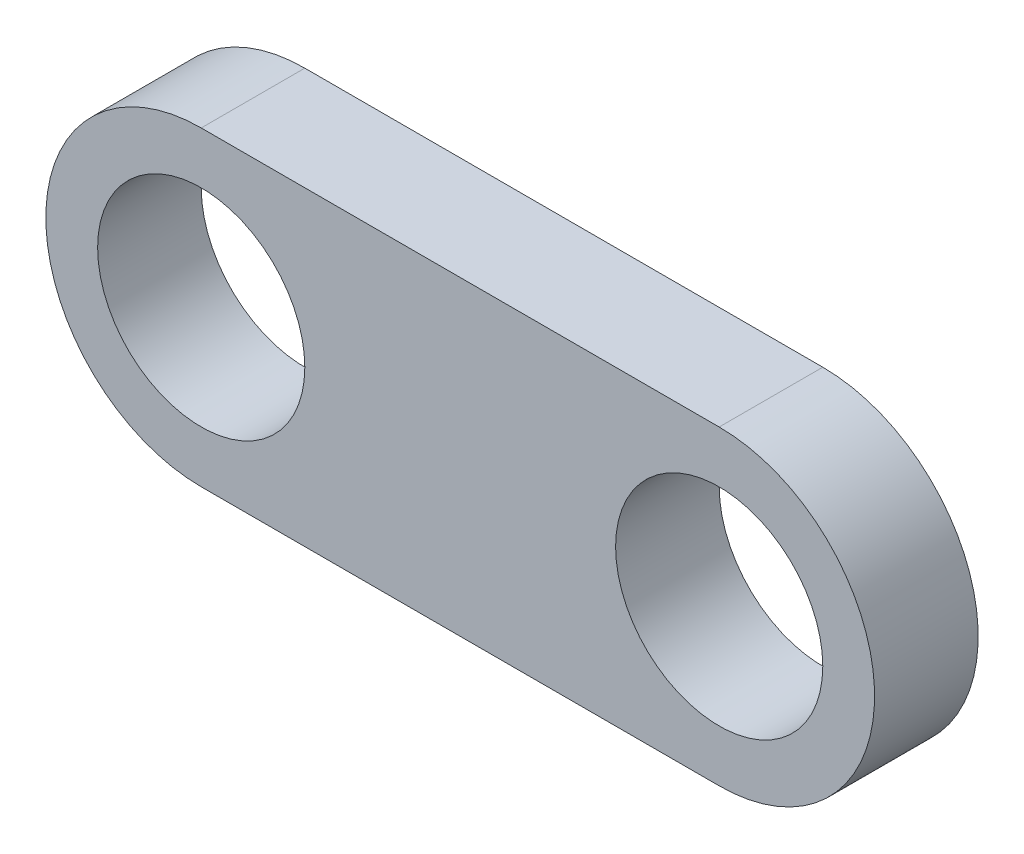
ISO-10303-21;
HEADER;
FILE_DESCRIPTION(('STEP AP214'),'2;1');
FILE_NAME('part.step','',(''),(''),'','','');
FILE_SCHEMA(('AUTOMOTIVE_DESIGN { 1 0 10303 214 1 1 1 1 }'));
ENDSEC;
DATA;
#1=APPLICATION_CONTEXT('core data for automotive mechanical design processes');
#2=APPLICATION_PROTOCOL_DEFINITION('international standard','automotive_design',2000,#1);
#3=PRODUCT_CONTEXT('',#1,'mechanical');
#4=PRODUCT('Part','Part','',(#3));
#5=PRODUCT_RELATED_PRODUCT_CATEGORY('part','',(#4));
#6=PRODUCT_DEFINITION_FORMATION('','',#4);
#7=PRODUCT_DEFINITION_CONTEXT('part definition',#1,'design');
#8=PRODUCT_DEFINITION('design','',#6,#7);
#9=PRODUCT_DEFINITION_SHAPE('','',#8);
#10=(LENGTH_UNIT() NAMED_UNIT(*) SI_UNIT(.MILLI.,.METRE.));
#11=(NAMED_UNIT(*) PLANE_ANGLE_UNIT() SI_UNIT($,.RADIAN.));
#12=(NAMED_UNIT(*) SI_UNIT($,.STERADIAN.) SOLID_ANGLE_UNIT());
#13=UNCERTAINTY_MEASURE_WITH_UNIT(LENGTH_MEASURE(1.E-05),#10,'distance_accuracy_value','');
#14=(GEOMETRIC_REPRESENTATION_CONTEXT(3) GLOBAL_UNCERTAINTY_ASSIGNED_CONTEXT((#13)) GLOBAL_UNIT_ASSIGNED_CONTEXT((#10,
#11,#12)) REPRESENTATION_CONTEXT('',''));
#15=CARTESIAN_POINT('',(0.,0.,0.));
#16=DIRECTION('',(0.,0.,1.));
#17=DIRECTION('',(1.,0.,0.));
#18=AXIS2_PLACEMENT_3D('',#15,#16,#17);
#19=CARTESIAN_POINT('',(0.,0.,5.));
#20=DIRECTION('',(0.,0.,1.));
#21=DIRECTION('',(1.,0.,0.));
#22=AXIS2_PLACEMENT_3D('',#19,#20,#21);
#23=PLANE('',#22);
#24=CARTESIAN_POINT('',(-50.,0.,5.));
#25=DIRECTION('',(0.,0.,1.));
#26=DIRECTION('',(1.,0.,0.));
#27=AXIS2_PLACEMENT_3D('',#24,#25,#26);
#28=CIRCLE('',#27,10.);
#29=CARTESIAN_POINT('',(-40.,0.,5.));
#30=VERTEX_POINT('',#29);
#31=EDGE_CURVE('E100',#30,#30,#28,.T.);
#32=ORIENTED_EDGE('',*,*,#31,.F.);
#33=EDGE_LOOP('',(#32));
#34=FACE_BOUND('',#33,.T.);
#35=CARTESIAN_POINT('',(0.,0.,5.));
#36=DIRECTION('',(0.,0.,1.));
#37=DIRECTION('',(1.,0.,0.));
#38=AXIS2_PLACEMENT_3D('',#35,#36,#37);
#39=CIRCLE('',#38,15.);
#40=CARTESIAN_POINT('',(0.,-15.,5.));
#41=VERTEX_POINT('',#40);
#42=CARTESIAN_POINT('',(0.,15.,5.));
#43=VERTEX_POINT('',#42);
#44=EDGE_CURVE('E85',#41,#43,#39,.T.);
#45=ORIENTED_EDGE('',*,*,#44,.T.);
#46=DIRECTION('',(-1.,0.,0.));
#47=VECTOR('',#46,1.);
#48=CARTESIAN_POINT('',(0.,15.,5.));
#49=LINE('',#48,#47);
#50=CARTESIAN_POINT('',(-50.,15.,5.));
#51=VERTEX_POINT('',#50);
#52=EDGE_CURVE('E80',#43,#51,#49,.T.);
#53=ORIENTED_EDGE('',*,*,#52,.T.);
#54=CARTESIAN_POINT('',(-50.,0.,5.));
#55=DIRECTION('',(0.,0.,1.));
#56=DIRECTION('',(1.,0.,0.));
#57=AXIS2_PLACEMENT_3D('',#54,#55,#56);
#58=CIRCLE('',#57,15.);
#59=CARTESIAN_POINT('',(-50.,-15.,5.));
#60=VERTEX_POINT('',#59);
#61=EDGE_CURVE('E83',#51,#60,#58,.T.);
#62=ORIENTED_EDGE('',*,*,#61,.T.);
#63=DIRECTION('',(1.,0.,0.));
#64=VECTOR('',#63,1.);
#65=CARTESIAN_POINT('',(0.,-15.,5.));
#66=LINE('',#65,#64);
#67=EDGE_CURVE('E50',#60,#41,#66,.T.);
#68=ORIENTED_EDGE('',*,*,#67,.T.);
#69=EDGE_LOOP('',(#45,#53,#62,#68));
#70=FACE_BOUND('',#69,.T.);
#71=CARTESIAN_POINT('',(0.,0.,5.));
#72=DIRECTION('',(0.,0.,1.));
#73=DIRECTION('',(1.,0.,0.));
#74=AXIS2_PLACEMENT_3D('',#71,#72,#73);
#75=CIRCLE('',#74,10.);
#76=CARTESIAN_POINT('',(10.,0.,5.));
#77=VERTEX_POINT('',#76);
#78=EDGE_CURVE('E115',#77,#77,#75,.T.);
#79=ORIENTED_EDGE('',*,*,#78,.F.);
#80=EDGE_LOOP('',(#79));
#81=FACE_BOUND('',#80,.T.);
#82=ADVANCED_FACE('F33',(#34,#70,#81),#23,.T.);
#83=CARTESIAN_POINT('',(0.,0.,-5.));
#84=DIRECTION('',(0.,0.,1.));
#85=DIRECTION('',(1.,0.,0.));
#86=AXIS2_PLACEMENT_3D('',#83,#84,#85);
#87=PLANE('',#86);
#88=CARTESIAN_POINT('',(0.,0.,-5.));
#89=DIRECTION('',(0.,0.,1.));
#90=DIRECTION('',(1.,0.,0.));
#91=AXIS2_PLACEMENT_3D('',#88,#89,#90);
#92=CIRCLE('',#91,15.);
#93=CARTESIAN_POINT('',(0.,-15.,-5.));
#94=VERTEX_POINT('',#93);
#95=CARTESIAN_POINT('',(0.,15.,-5.));
#96=VERTEX_POINT('',#95);
#97=EDGE_CURVE('E97',#94,#96,#92,.T.);
#98=ORIENTED_EDGE('',*,*,#97,.F.);
#99=DIRECTION('',(1.,0.,0.));
#100=VECTOR('',#99,1.);
#101=CARTESIAN_POINT('',(0.,-15.,-5.));
#102=LINE('',#101,#100);
#103=CARTESIAN_POINT('',(-50.,-15.,-5.));
#104=VERTEX_POINT('',#103);
#105=EDGE_CURVE('E73',#104,#94,#102,.T.);
#106=ORIENTED_EDGE('',*,*,#105,.F.);
#107=CARTESIAN_POINT('',(-50.,0.,-5.));
#108=DIRECTION('',(0.,0.,1.));
#109=DIRECTION('',(1.,0.,0.));
#110=AXIS2_PLACEMENT_3D('',#107,#108,#109);
#111=CIRCLE('',#110,15.);
#112=CARTESIAN_POINT('',(-50.,15.,-5.));
#113=VERTEX_POINT('',#112);
#114=EDGE_CURVE('E67',#113,#104,#111,.T.);
#115=ORIENTED_EDGE('',*,*,#114,.F.);
#116=DIRECTION('',(-1.,0.,0.));
#117=VECTOR('',#116,1.);
#118=CARTESIAN_POINT('',(0.,15.,-5.));
#119=LINE('',#118,#117);
#120=EDGE_CURVE('E89',#96,#113,#119,.T.);
#121=ORIENTED_EDGE('',*,*,#120,.F.);
#122=EDGE_LOOP('',(#98,#106,#115,#121));
#123=FACE_BOUND('',#122,.T.);
#124=CARTESIAN_POINT('',(-50.,0.,-5.));
#125=DIRECTION('',(0.,0.,1.));
#126=DIRECTION('',(1.,0.,0.));
#127=AXIS2_PLACEMENT_3D('',#124,#125,#126);
#128=CIRCLE('',#127,10.);
#129=CARTESIAN_POINT('',(-40.,0.,-5.));
#130=VERTEX_POINT('',#129);
#131=EDGE_CURVE('E112',#130,#130,#128,.T.);
#132=ORIENTED_EDGE('',*,*,#131,.T.);
#133=EDGE_LOOP('',(#132));
#134=FACE_BOUND('',#133,.T.);
#135=CARTESIAN_POINT('',(0.,0.,-5.));
#136=DIRECTION('',(0.,0.,1.));
#137=DIRECTION('',(1.,0.,0.));
#138=AXIS2_PLACEMENT_3D('',#135,#136,#137);
#139=CIRCLE('',#138,10.);
#140=CARTESIAN_POINT('',(10.,0.,-5.));
#141=VERTEX_POINT('',#140);
#142=EDGE_CURVE('E118',#141,#141,#139,.T.);
#143=ORIENTED_EDGE('',*,*,#142,.T.);
#144=EDGE_LOOP('',(#143));
#145=FACE_BOUND('',#144,.T.);
#146=ADVANCED_FACE('F108',(#123,#134,#145),#87,.F.);
#147=CARTESIAN_POINT('',(0.,0.,5.));
#148=DIRECTION('',(0.,0.,-1.));
#149=DIRECTION('',(-1.,0.,0.));
#150=AXIS2_PLACEMENT_3D('',#147,#148,#149);
#151=CYLINDRICAL_SURFACE('',#150,15.);
#152=ORIENTED_EDGE('',*,*,#97,.T.);
#153=DIRECTION('',(0.,0.,-1.));
#154=VECTOR('',#153,1.);
#155=CARTESIAN_POINT('',(0.,15.,5.));
#156=LINE('',#155,#154);
#157=EDGE_CURVE('E11',#43,#96,#156,.T.);
#158=ORIENTED_EDGE('',*,*,#157,.F.);
#159=ORIENTED_EDGE('',*,*,#44,.F.);
#160=DIRECTION('',(0.,0.,-1.));
#161=VECTOR('',#160,1.);
#162=CARTESIAN_POINT('',(0.,-15.,5.));
#163=LINE('',#162,#161);
#164=EDGE_CURVE('E93',#41,#94,#163,.T.);
#165=ORIENTED_EDGE('',*,*,#164,.T.);
#166=EDGE_LOOP('',(#152,#158,#159,#165));
#167=FACE_BOUND('',#166,.T.);
#168=ADVANCED_FACE('F35',(#167),#151,.T.);
#169=CARTESIAN_POINT('',(0.,15.,5.));
#170=DIRECTION('',(0.,-1.,0.));
#171=DIRECTION('',(1.,0.,0.));
#172=AXIS2_PLACEMENT_3D('',#169,#170,#171);
#173=PLANE('',#172);
#174=ORIENTED_EDGE('',*,*,#120,.T.);
#175=DIRECTION('',(0.,0.,-1.));
#176=VECTOR('',#175,1.);
#177=CARTESIAN_POINT('',(-50.,15.,5.));
#178=LINE('',#177,#176);
#179=EDGE_CURVE('E42',#51,#113,#178,.T.);
#180=ORIENTED_EDGE('',*,*,#179,.F.);
#181=ORIENTED_EDGE('',*,*,#52,.F.);
#182=ORIENTED_EDGE('',*,*,#157,.T.);
#183=EDGE_LOOP('',(#174,#180,#181,#182));
#184=FACE_BOUND('',#183,.T.);
#185=ADVANCED_FACE('F88',(#184),#173,.F.);
#186=CARTESIAN_POINT('',(-50.,0.,5.));
#187=DIRECTION('',(0.,0.,-1.));
#188=DIRECTION('',(-1.,0.,0.));
#189=AXIS2_PLACEMENT_3D('',#186,#187,#188);
#190=CYLINDRICAL_SURFACE('',#189,15.);
#191=ORIENTED_EDGE('',*,*,#114,.T.);
#192=DIRECTION('',(0.,0.,-1.));
#193=VECTOR('',#192,1.);
#194=CARTESIAN_POINT('',(-50.,-15.,5.));
#195=LINE('',#194,#193);
#196=EDGE_CURVE('E90',#60,#104,#195,.T.);
#197=ORIENTED_EDGE('',*,*,#196,.F.);
#198=ORIENTED_EDGE('',*,*,#61,.F.);
#199=ORIENTED_EDGE('',*,*,#179,.T.);
#200=EDGE_LOOP('',(#191,#197,#198,#199));
#201=FACE_BOUND('',#200,.T.);
#202=ADVANCED_FACE('F91',(#201),#190,.T.);
#203=CARTESIAN_POINT('',(0.,-15.,5.));
#204=DIRECTION('',(0.,1.,0.));
#205=DIRECTION('',(-1.,0.,0.));
#206=AXIS2_PLACEMENT_3D('',#203,#204,#205);
#207=PLANE('',#206);
#208=ORIENTED_EDGE('',*,*,#105,.T.);
#209=ORIENTED_EDGE('',*,*,#164,.F.);
#210=ORIENTED_EDGE('',*,*,#67,.F.);
#211=ORIENTED_EDGE('',*,*,#196,.T.);
#212=EDGE_LOOP('',(#208,#209,#210,#211));
#213=FACE_BOUND('',#212,.T.);
#214=ADVANCED_FACE('F105',(#213),#207,.F.);
#215=CARTESIAN_POINT('',(-50.,0.,5.));
#216=DIRECTION('',(0.,0.,-1.));
#217=DIRECTION('',(-1.,0.,0.));
#218=AXIS2_PLACEMENT_3D('',#215,#216,#217);
#219=CYLINDRICAL_SURFACE('',#218,10.);
#220=ORIENTED_EDGE('',*,*,#31,.T.);
#221=EDGE_LOOP('',(#220));
#222=FACE_BOUND('',#221,.T.);
#223=ORIENTED_EDGE('',*,*,#131,.F.);
#224=EDGE_LOOP('',(#223));
#225=FACE_BOUND('',#224,.T.);
#226=ADVANCED_FACE('F135',(#222,#225),#219,.F.);
#227=CARTESIAN_POINT('',(0.,0.,5.));
#228=DIRECTION('',(0.,0.,-1.));
#229=DIRECTION('',(-1.,0.,0.));
#230=AXIS2_PLACEMENT_3D('',#227,#228,#229);
#231=CYLINDRICAL_SURFACE('',#230,10.);
#232=ORIENTED_EDGE('',*,*,#78,.T.);
#233=EDGE_LOOP('',(#232));
#234=FACE_BOUND('',#233,.T.);
#235=ORIENTED_EDGE('',*,*,#142,.F.);
#236=EDGE_LOOP('',(#235));
#237=FACE_BOUND('',#236,.T.);
#238=ADVANCED_FACE('F124',(#234,#237),#231,.F.);
#239=CLOSED_SHELL('',(#82,#146,#168,#185,#202,#214,#226,#238));
#240=MANIFOLD_SOLID_BREP('B2',#239);
#241=ADVANCED_BREP_SHAPE_REPRESENTATION('',(#18,#240),#14);
#242=SHAPE_DEFINITION_REPRESENTATION(#9,#241);
ENDSEC;
END-ISO-10303-21;
